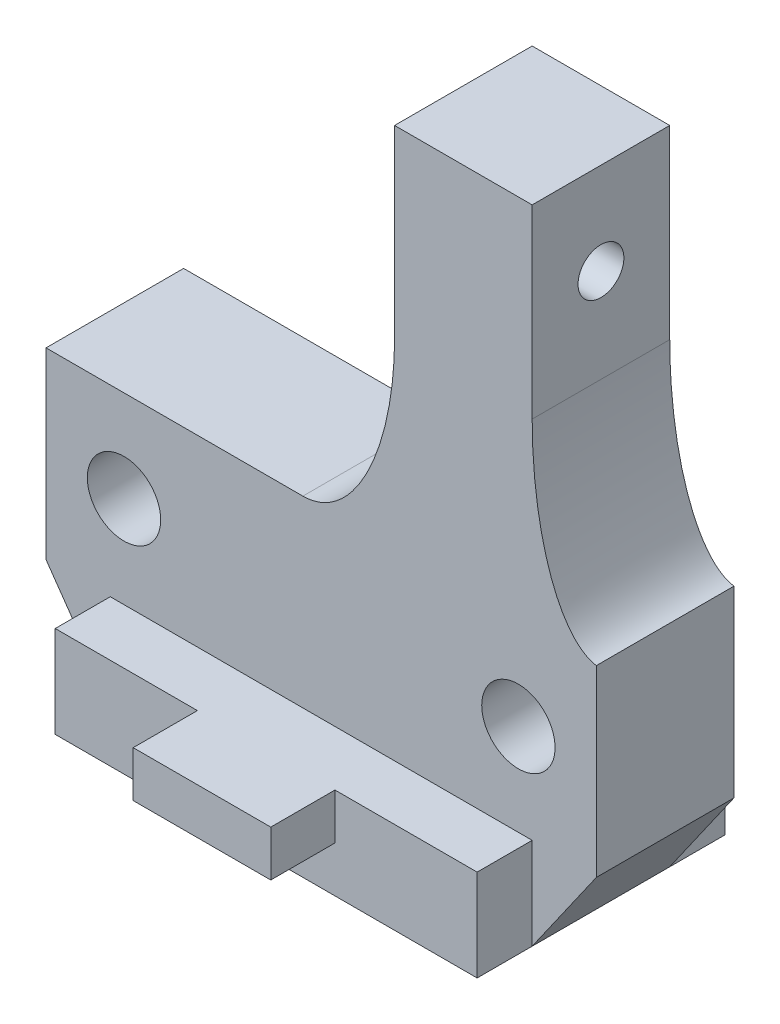
ISO-10303-21;
HEADER;
FILE_DESCRIPTION(('STEP AP214'),'2;1');
FILE_NAME('part.step','',(''),(''),'','','');
FILE_SCHEMA(('AUTOMOTIVE_DESIGN { 1 0 10303 214 1 1 1 1 }'));
ENDSEC;
DATA;
#1=APPLICATION_CONTEXT('core data for automotive mechanical design processes');
#2=APPLICATION_PROTOCOL_DEFINITION('international standard','automotive_design',2000,#1);
#3=PRODUCT_CONTEXT('',#1,'mechanical');
#4=PRODUCT('Part','Part','',(#3));
#5=PRODUCT_RELATED_PRODUCT_CATEGORY('part','',(#4));
#6=PRODUCT_DEFINITION_FORMATION('','',#4);
#7=PRODUCT_DEFINITION_CONTEXT('part definition',#1,'design');
#8=PRODUCT_DEFINITION('design','',#6,#7);
#9=PRODUCT_DEFINITION_SHAPE('','',#8);
#10=(LENGTH_UNIT() NAMED_UNIT(*) SI_UNIT(.MILLI.,.METRE.));
#11=(NAMED_UNIT(*) PLANE_ANGLE_UNIT() SI_UNIT($,.RADIAN.));
#12=(NAMED_UNIT(*) SI_UNIT($,.STERADIAN.) SOLID_ANGLE_UNIT());
#13=UNCERTAINTY_MEASURE_WITH_UNIT(LENGTH_MEASURE(1.E-05),#10,'distance_accuracy_value','');
#14=(GEOMETRIC_REPRESENTATION_CONTEXT(3) GLOBAL_UNCERTAINTY_ASSIGNED_CONTEXT((#13)) GLOBAL_UNIT_ASSIGNED_CONTEXT((#10,
#11,#12)) REPRESENTATION_CONTEXT('',''));
#15=CARTESIAN_POINT('',(0.,0.,0.));
#16=DIRECTION('',(0.,0.,1.));
#17=DIRECTION('',(1.,0.,0.));
#18=AXIS2_PLACEMENT_3D('',#15,#16,#17);
#19=CARTESIAN_POINT('',(46.,10.,0.));
#20=DIRECTION('',(-1.,0.,0.));
#21=DIRECTION('',(0.,0.,1.));
#22=AXIS2_PLACEMENT_3D('',#19,#20,#21);
#23=PLANE('',#22);
#24=DIRECTION('',(0.,1.,0.));
#25=VECTOR('',#24,1.);
#26=CARTESIAN_POINT('',(46.,10.,-21.));
#27=LINE('',#26,#25);
#28=CARTESIAN_POINT('',(46.,0.,-21.));
#29=VERTEX_POINT('',#28);
#30=CARTESIAN_POINT('',(46.,10.,-21.));
#31=VERTEX_POINT('',#30);
#32=EDGE_CURVE('E218',#29,#31,#27,.T.);
#33=ORIENTED_EDGE('',*,*,#32,.F.);
#34=DIRECTION('',(0.,0.,-1.));
#35=VECTOR('',#34,1.);
#36=CARTESIAN_POINT('',(46.,0.,0.));
#37=LINE('',#36,#35);
#38=CARTESIAN_POINT('',(46.,0.,-27.));
#39=VERTEX_POINT('',#38);
#40=EDGE_CURVE('E619',#29,#39,#37,.T.);
#41=ORIENTED_EDGE('',*,*,#40,.T.);
#42=DIRECTION('',(0.,-1.,0.));
#43=VECTOR('',#42,1.);
#44=CARTESIAN_POINT('',(46.,10.,-27.));
#45=LINE('',#44,#43);
#46=CARTESIAN_POINT('',(46.,10.,-27.));
#47=VERTEX_POINT('',#46);
#48=EDGE_CURVE('E627',#47,#39,#45,.T.);
#49=ORIENTED_EDGE('',*,*,#48,.F.);
#50=DIRECTION('',(0.,0.,-1.));
#51=VECTOR('',#50,1.);
#52=CARTESIAN_POINT('',(46.,10.,0.));
#53=LINE('',#52,#51);
#54=EDGE_CURVE('E592',#31,#47,#53,.T.);
#55=ORIENTED_EDGE('',*,*,#54,.F.);
#56=EDGE_LOOP('',(#33,#41,#49,#55));
#57=FACE_BOUND('',#56,.T.);
#58=ADVANCED_FACE('F41',(#57),#23,.F.);
#59=DIRECTION('',(0.,-1.,0.));
#60=VECTOR('',#59,1.);
#61=CARTESIAN_POINT('',(46.,10.,-6.));
#62=LINE('',#61,#60);
#63=CARTESIAN_POINT('',(46.,10.,-6.));
#64=VERTEX_POINT('',#63);
#65=CARTESIAN_POINT('',(46.,0.,-6.));
#66=VERTEX_POINT('',#65);
#67=EDGE_CURVE('E215',#64,#66,#62,.T.);
#68=ORIENTED_EDGE('',*,*,#67,.F.);
#69=CARTESIAN_POINT('',(46.,10.,0.));
#70=VERTEX_POINT('',#69);
#71=EDGE_CURVE('E608',#70,#64,#53,.T.);
#72=ORIENTED_EDGE('',*,*,#71,.F.);
#73=DIRECTION('',(0.,-1.,0.));
#74=VECTOR('',#73,1.);
#75=CARTESIAN_POINT('',(46.,10.,0.));
#76=LINE('',#75,#74);
#77=CARTESIAN_POINT('',(46.,0.,0.));
#78=VERTEX_POINT('',#77);
#79=EDGE_CURVE('E601',#70,#78,#76,.T.);
#80=ORIENTED_EDGE('',*,*,#79,.T.);
#81=EDGE_CURVE('E620',#78,#66,#37,.T.);
#82=ORIENTED_EDGE('',*,*,#81,.T.);
#83=EDGE_LOOP('',(#68,#72,#80,#82));
#84=FACE_BOUND('',#83,.T.);
#85=ADVANCED_FACE('F556',(#84),#23,.F.);
#86=CARTESIAN_POINT('',(0.,10.,0.));
#87=DIRECTION('',(1.,0.,0.));
#88=DIRECTION('',(0.,0.,-1.));
#89=AXIS2_PLACEMENT_3D('',#86,#87,#88);
#90=PLANE('',#89);
#91=DIRECTION('',(0.,1.,0.));
#92=VECTOR('',#91,1.);
#93=CARTESIAN_POINT('',(0.,10.,-6.));
#94=LINE('',#93,#92);
#95=CARTESIAN_POINT('',(0.,0.,-5.99999999999999));
#96=VERTEX_POINT('',#95);
#97=CARTESIAN_POINT('',(0.,10.,-6.));
#98=VERTEX_POINT('',#97);
#99=EDGE_CURVE('E250',#96,#98,#94,.T.);
#100=ORIENTED_EDGE('',*,*,#99,.F.);
#101=DIRECTION('',(0.,0.,1.));
#102=VECTOR('',#101,1.);
#103=CARTESIAN_POINT('',(0.,0.,0.));
#104=LINE('',#103,#102);
#105=CARTESIAN_POINT('',(0.,0.,0.));
#106=VERTEX_POINT('',#105);
#107=EDGE_CURVE('E617',#96,#106,#104,.T.);
#108=ORIENTED_EDGE('',*,*,#107,.T.);
#109=DIRECTION('',(0.,-1.,0.));
#110=VECTOR('',#109,1.);
#111=CARTESIAN_POINT('',(0.,10.,0.));
#112=LINE('',#111,#110);
#113=CARTESIAN_POINT('',(0.,10.,0.));
#114=VERTEX_POINT('',#113);
#115=EDGE_CURVE('E630',#114,#106,#112,.T.);
#116=ORIENTED_EDGE('',*,*,#115,.F.);
#117=DIRECTION('',(0.,0.,1.));
#118=VECTOR('',#117,1.);
#119=CARTESIAN_POINT('',(0.,10.,0.));
#120=LINE('',#119,#118);
#121=EDGE_CURVE('E591',#98,#114,#120,.T.);
#122=ORIENTED_EDGE('',*,*,#121,.F.);
#123=EDGE_LOOP('',(#100,#108,#116,#122));
#124=FACE_BOUND('',#123,.T.);
#125=ADVANCED_FACE('F357',(#124),#90,.F.);
#126=DIRECTION('',(0.,-1.,0.));
#127=VECTOR('',#126,1.);
#128=CARTESIAN_POINT('',(0.,10.,-21.));
#129=LINE('',#128,#127);
#130=CARTESIAN_POINT('',(0.,10.,-21.));
#131=VERTEX_POINT('',#130);
#132=CARTESIAN_POINT('',(0.,0.,-21.));
#133=VERTEX_POINT('',#132);
#134=EDGE_CURVE('E244',#131,#133,#129,.T.);
#135=ORIENTED_EDGE('',*,*,#134,.F.);
#136=CARTESIAN_POINT('',(0.,10.,-27.));
#137=VERTEX_POINT('',#136);
#138=EDGE_CURVE('E603',#137,#131,#120,.T.);
#139=ORIENTED_EDGE('',*,*,#138,.F.);
#140=DIRECTION('',(0.,-1.,0.));
#141=VECTOR('',#140,1.);
#142=CARTESIAN_POINT('',(0.,10.,-27.));
#143=LINE('',#142,#141);
#144=CARTESIAN_POINT('',(0.,0.,-27.));
#145=VERTEX_POINT('',#144);
#146=EDGE_CURVE('E612',#137,#145,#143,.T.);
#147=ORIENTED_EDGE('',*,*,#146,.T.);
#148=EDGE_CURVE('E613',#145,#133,#104,.T.);
#149=ORIENTED_EDGE('',*,*,#148,.T.);
#150=EDGE_LOOP('',(#135,#139,#147,#149));
#151=FACE_BOUND('',#150,.T.);
#152=ADVANCED_FACE('F570',(#151),#90,.F.);
#153=CARTESIAN_POINT('',(0.,10.,0.));
#154=DIRECTION('',(0.,0.,-1.));
#155=DIRECTION('',(-1.,0.,0.));
#156=AXIS2_PLACEMENT_3D('',#153,#154,#155);
#157=PLANE('',#156);
#158=DIRECTION('',(0.,-1.,0.));
#159=VECTOR('',#158,1.);
#160=CARTESIAN_POINT('',(15.5,10.,0.));
#161=LINE('',#160,#159);
#162=CARTESIAN_POINT('',(15.5,10.,0.));
#163=VERTEX_POINT('',#162);
#164=CARTESIAN_POINT('',(15.5,5.,0.));
#165=VERTEX_POINT('',#164);
#166=EDGE_CURVE('E256',#163,#165,#161,.T.);
#167=ORIENTED_EDGE('',*,*,#166,.F.);
#168=DIRECTION('',(1.,0.,0.));
#169=VECTOR('',#168,1.);
#170=CARTESIAN_POINT('',(0.,10.,0.));
#171=LINE('',#170,#169);
#172=EDGE_CURVE('E582',#114,#163,#171,.T.);
#173=ORIENTED_EDGE('',*,*,#172,.F.);
#174=ORIENTED_EDGE('',*,*,#115,.T.);
#175=DIRECTION('',(1.,0.,0.));
#176=VECTOR('',#175,1.);
#177=CARTESIAN_POINT('',(0.,0.,0.));
#178=LINE('',#177,#176);
#179=EDGE_CURVE('E616',#106,#78,#178,.T.);
#180=ORIENTED_EDGE('',*,*,#179,.T.);
#181=ORIENTED_EDGE('',*,*,#79,.F.);
#182=CARTESIAN_POINT('',(30.5,10.,0.));
#183=VERTEX_POINT('',#182);
#184=EDGE_CURVE('E593',#183,#70,#171,.T.);
#185=ORIENTED_EDGE('',*,*,#184,.F.);
#186=DIRECTION('',(0.,1.,0.));
#187=VECTOR('',#186,1.);
#188=CARTESIAN_POINT('',(30.5,10.,0.));
#189=LINE('',#188,#187);
#190=CARTESIAN_POINT('',(30.5,5.00000000000001,0.));
#191=VERTEX_POINT('',#190);
#192=EDGE_CURVE('E262',#191,#183,#189,.T.);
#193=ORIENTED_EDGE('',*,*,#192,.F.);
#194=DIRECTION('',(1.,0.,0.));
#195=VECTOR('',#194,1.);
#196=CARTESIAN_POINT('',(15.5,5.,0.));
#197=LINE('',#196,#195);
#198=EDGE_CURVE('E271',#165,#191,#197,.T.);
#199=ORIENTED_EDGE('',*,*,#198,.F.);
#200=EDGE_LOOP('',(#167,#173,#174,#180,#181,#185,#193,#199));
#201=FACE_BOUND('',#200,.T.);
#202=ADVANCED_FACE('F567',(#201),#157,.F.);
#203=CARTESIAN_POINT('',(0.,10.,0.));
#204=DIRECTION('',(0.,-1.,0.));
#205=DIRECTION('',(0.,0.,-1.));
#206=AXIS2_PLACEMENT_3D('',#203,#204,#205);
#207=PLANE('',#206);
#208=DIRECTION('',(-1.,0.,0.));
#209=VECTOR('',#208,1.);
#210=CARTESIAN_POINT('',(-7.,10.,-21.));
#211=LINE('',#210,#209);
#212=EDGE_CURVE('E633',#31,#131,#211,.T.);
#213=ORIENTED_EDGE('',*,*,#212,.F.);
#214=ORIENTED_EDGE('',*,*,#54,.T.);
#215=DIRECTION('',(-1.,0.,0.));
#216=VECTOR('',#215,1.);
#217=CARTESIAN_POINT('',(0.,10.,-27.));
#218=LINE('',#217,#216);
#219=EDGE_CURVE('E610',#47,#137,#218,.T.);
#220=ORIENTED_EDGE('',*,*,#219,.T.);
#221=ORIENTED_EDGE('',*,*,#138,.T.);
#222=EDGE_LOOP('',(#213,#214,#220,#221));
#223=FACE_BOUND('',#222,.T.);
#224=ADVANCED_FACE('F569',(#223),#207,.F.);
#225=DIRECTION('',(1.,0.,0.));
#226=VECTOR('',#225,1.);
#227=CARTESIAN_POINT('',(-6.99999999999999,10.,-6.));
#228=LINE('',#227,#226);
#229=EDGE_CURVE('E631',#98,#64,#228,.T.);
#230=ORIENTED_EDGE('',*,*,#229,.F.);
#231=ORIENTED_EDGE('',*,*,#121,.T.);
#232=ORIENTED_EDGE('',*,*,#172,.T.);
#233=DIRECTION('',(0.,0.,-1.));
#234=VECTOR('',#233,1.);
#235=CARTESIAN_POINT('',(15.5,10.,7.));
#236=LINE('',#235,#234);
#237=CARTESIAN_POINT('',(15.5,10.,7.));
#238=VERTEX_POINT('',#237);
#239=EDGE_CURVE('E268',#238,#163,#236,.T.);
#240=ORIENTED_EDGE('',*,*,#239,.F.);
#241=DIRECTION('',(-1.,0.,0.));
#242=VECTOR('',#241,1.);
#243=CARTESIAN_POINT('',(15.5,10.,7.));
#244=LINE('',#243,#242);
#245=CARTESIAN_POINT('',(30.5,10.,7.));
#246=VERTEX_POINT('',#245);
#247=EDGE_CURVE('E266',#246,#238,#244,.T.);
#248=ORIENTED_EDGE('',*,*,#247,.F.);
#249=DIRECTION('',(0.,0.,-1.));
#250=VECTOR('',#249,1.);
#251=CARTESIAN_POINT('',(30.5,10.,7.));
#252=LINE('',#251,#250);
#253=EDGE_CURVE('E278',#246,#183,#252,.T.);
#254=ORIENTED_EDGE('',*,*,#253,.T.);
#255=ORIENTED_EDGE('',*,*,#184,.T.);
#256=ORIENTED_EDGE('',*,*,#71,.T.);
#257=EDGE_LOOP('',(#230,#231,#232,#240,#248,#254,#255,#256));
#258=FACE_BOUND('',#257,.T.);
#259=ADVANCED_FACE('F576',(#258),#207,.F.);
#260=CARTESIAN_POINT('',(0.,10.,-27.));
#261=DIRECTION('',(0.,0.,1.));
#262=DIRECTION('',(1.,0.,0.));
#263=AXIS2_PLACEMENT_3D('',#260,#261,#262);
#264=PLANE('',#263);
#265=DIRECTION('',(-1.,0.,0.));
#266=VECTOR('',#265,1.);
#267=CARTESIAN_POINT('',(0.,0.,-27.));
#268=LINE('',#267,#266);
#269=EDGE_CURVE('E623',#39,#145,#268,.T.);
#270=ORIENTED_EDGE('',*,*,#269,.T.);
#271=ORIENTED_EDGE('',*,*,#146,.F.);
#272=ORIENTED_EDGE('',*,*,#219,.F.);
#273=ORIENTED_EDGE('',*,*,#48,.T.);
#274=EDGE_LOOP('',(#270,#271,#272,#273));
#275=FACE_BOUND('',#274,.T.);
#276=ADVANCED_FACE('F565',(#275),#264,.F.);
#277=CARTESIAN_POINT('',(0.,0.,0.));
#278=DIRECTION('',(0.,-1.,0.));
#279=DIRECTION('',(0.,0.,-1.));
#280=AXIS2_PLACEMENT_3D('',#277,#278,#279);
#281=PLANE('',#280);
#282=ORIENTED_EDGE('',*,*,#148,.F.);
#283=ORIENTED_EDGE('',*,*,#269,.F.);
#284=ORIENTED_EDGE('',*,*,#40,.F.);
#285=DIRECTION('',(0.,0.,-1.));
#286=VECTOR('',#285,1.);
#287=CARTESIAN_POINT('',(46.,0.,-6.));
#288=LINE('',#287,#286);
#289=EDGE_CURVE('E241',#66,#29,#288,.T.);
#290=ORIENTED_EDGE('',*,*,#289,.F.);
#291=ORIENTED_EDGE('',*,*,#81,.F.);
#292=ORIENTED_EDGE('',*,*,#179,.F.);
#293=ORIENTED_EDGE('',*,*,#107,.F.);
#294=DIRECTION('',(0.,0.,1.));
#295=VECTOR('',#294,1.);
#296=CARTESIAN_POINT('',(0.,0.,-21.));
#297=LINE('',#296,#295);
#298=EDGE_CURVE('E252',#133,#96,#297,.T.);
#299=ORIENTED_EDGE('',*,*,#298,.F.);
#300=EDGE_LOOP('',(#282,#283,#284,#290,#291,#292,#293,#299));
#301=FACE_BOUND('',#300,.T.);
#302=ADVANCED_FACE('F649',(#301),#281,.T.);
#303=CARTESIAN_POINT('',(-7.,30.,-21.));
#304=DIRECTION('',(1.,0.,0.));
#305=DIRECTION('',(0.,0.,-1.));
#306=AXIS2_PLACEMENT_3D('',#303,#304,#305);
#307=PLANE('',#306);
#308=DIRECTION('',(0.,0.,1.));
#309=VECTOR('',#308,1.);
#310=CARTESIAN_POINT('',(-7.,10.,-21.));
#311=LINE('',#310,#309);
#312=CARTESIAN_POINT('',(-7.,10.,-21.));
#313=VERTEX_POINT('',#312);
#314=CARTESIAN_POINT('',(-7.,10.,-6.));
#315=VERTEX_POINT('',#314);
#316=EDGE_CURVE('E299',#313,#315,#311,.T.);
#317=ORIENTED_EDGE('',*,*,#316,.T.);
#318=DIRECTION('',(0.,-1.,0.));
#319=VECTOR('',#318,1.);
#320=CARTESIAN_POINT('',(-6.99999999999999,30.,-6.));
#321=LINE('',#320,#319);
#322=CARTESIAN_POINT('',(-6.99999999999999,30.,-6.));
#323=VERTEX_POINT('',#322);
#324=EDGE_CURVE('E422',#323,#315,#321,.T.);
#325=ORIENTED_EDGE('',*,*,#324,.F.);
#326=DIRECTION('',(0.,0.,1.));
#327=VECTOR('',#326,1.);
#328=CARTESIAN_POINT('',(-7.,30.,-21.));
#329=LINE('',#328,#327);
#330=CARTESIAN_POINT('',(-7.,30.,-21.));
#331=VERTEX_POINT('',#330);
#332=EDGE_CURVE('E300',#331,#323,#329,.T.);
#333=ORIENTED_EDGE('',*,*,#332,.F.);
#334=DIRECTION('',(0.,-1.,0.));
#335=VECTOR('',#334,1.);
#336=CARTESIAN_POINT('',(-7.,30.,-21.));
#337=LINE('',#336,#335);
#338=EDGE_CURVE('E328',#331,#313,#337,.T.);
#339=ORIENTED_EDGE('',*,*,#338,.T.);
#340=EDGE_LOOP('',(#317,#325,#333,#339));
#341=FACE_BOUND('',#340,.T.);
#342=ADVANCED_FACE('F446',(#341),#307,.F.);
#343=CARTESIAN_POINT('',(-6.99999999999999,30.,-6.));
#344=DIRECTION('',(0.,0.,-1.));
#345=DIRECTION('',(-1.,0.,0.));
#346=AXIS2_PLACEMENT_3D('',#343,#344,#345);
#347=PLANE('',#346);
#348=CARTESIAN_POINT('',(44.5,20.,-6.));
#349=DIRECTION('',(0.,0.,-1.));
#350=DIRECTION('',(-1.,0.,0.));
#351=AXIS2_PLACEMENT_3D('',#348,#349,#350);
#352=CIRCLE('',#351,4.);
#353=CARTESIAN_POINT('',(40.5,20.,-6.));
#354=VERTEX_POINT('',#353);
#355=EDGE_CURVE('E296',#354,#354,#352,.T.);
#356=ORIENTED_EDGE('',*,*,#355,.T.);
#357=EDGE_LOOP('',(#356));
#358=FACE_BOUND('',#357,.T.);
#359=CARTESIAN_POINT('',(1.5,20.,-6.));
#360=DIRECTION('',(0.,0.,-1.));
#361=DIRECTION('',(-1.,0.,0.));
#362=AXIS2_PLACEMENT_3D('',#359,#360,#361);
#363=CIRCLE('',#362,4.);
#364=CARTESIAN_POINT('',(-2.5,20.,-6.));
#365=VERTEX_POINT('',#364);
#366=EDGE_CURVE('E291',#365,#365,#363,.T.);
#367=ORIENTED_EDGE('',*,*,#366,.T.);
#368=EDGE_LOOP('',(#367));
#369=FACE_BOUND('',#368,.T.);
#370=ORIENTED_EDGE('',*,*,#324,.T.);
#371=DIRECTION('',(0.573462344363329,-0.81923192051904,0.));
#372=VECTOR('',#371,1.);
#373=CARTESIAN_POINT('',(-12.4316726028097,17.7595322897281,-6.));
#374=LINE('',#373,#372);
#375=EDGE_CURVE('E246',#315,#96,#374,.T.);
#376=ORIENTED_EDGE('',*,*,#375,.T.);
#377=ORIENTED_EDGE('',*,*,#99,.T.);
#378=ORIENTED_EDGE('',*,*,#229,.T.);
#379=ORIENTED_EDGE('',*,*,#67,.T.);
#380=DIRECTION('',(0.573462344363328,0.81923192051904,0.));
#381=VECTOR('',#380,1.);
#382=CARTESIAN_POINT('',(58.4316726028097,17.7595322897281,-6.));
#383=LINE('',#382,#381);
#384=CARTESIAN_POINT('',(53.,10.,-6.));
#385=VERTEX_POINT('',#384);
#386=EDGE_CURVE('E239',#66,#385,#383,.T.);
#387=ORIENTED_EDGE('',*,*,#386,.T.);
#388=DIRECTION('',(0.,-1.,0.));
#389=VECTOR('',#388,1.);
#390=CARTESIAN_POINT('',(53.,30.,-6.));
#391=LINE('',#390,#389);
#392=CARTESIAN_POINT('',(53.,30.,-6.));
#393=VERTEX_POINT('',#392);
#394=EDGE_CURVE('E419',#393,#385,#391,.T.);
#395=ORIENTED_EDGE('',*,*,#394,.F.);
#396=CARTESIAN_POINT('',(46.,49.7737199332852,-6.));
#397=CARTESIAN_POINT('',(46.,31.0620156485908,-6.));
#398=CARTESIAN_POINT('',(53.,30.,-6.));
#399=(BOUNDED_CURVE() B_SPLINE_CURVE(2,(#396,#397,#398),.UNSPECIFIED.,.F.,
.F.) B_SPLINE_CURVE_WITH_KNOTS((3,3),(0.,1.),
.UNSPECIFIED.) CURVE() GEOMETRIC_REPRESENTATION_ITEM() RATIONAL_B_SPLINE_CURVE((1.,
0.758287544405155,1.)) REPRESENTATION_ITEM(''));
#400=CARTESIAN_POINT('',(46.,49.7737199332852,-6.));
#401=VERTEX_POINT('',#400);
#402=EDGE_CURVE('E12',#393,#401,#399,.F.);
#403=ORIENTED_EDGE('',*,*,#402,.T.);
#404=DIRECTION('',(0.,-1.,0.));
#405=VECTOR('',#404,1.);
#406=CARTESIAN_POINT('',(46.,70.,-6.));
#407=LINE('',#406,#405);
#408=CARTESIAN_POINT('',(46.,70.,-6.));
#409=VERTEX_POINT('',#408);
#410=EDGE_CURVE('E229',#409,#401,#407,.T.);
#411=ORIENTED_EDGE('',*,*,#410,.F.);
#412=DIRECTION('',(1.,0.,0.));
#413=VECTOR('',#412,1.);
#414=CARTESIAN_POINT('',(46.,70.,-6.));
#415=LINE('',#414,#413);
#416=CARTESIAN_POINT('',(31.,70.,-6.));
#417=VERTEX_POINT('',#416);
#418=EDGE_CURVE('E208',#417,#409,#415,.T.);
#419=ORIENTED_EDGE('',*,*,#418,.F.);
#420=DIRECTION('',(0.,-1.,0.));
#421=VECTOR('',#420,1.);
#422=CARTESIAN_POINT('',(31.,70.,-6.));
#423=LINE('',#422,#421);
#424=CARTESIAN_POINT('',(31.,50.,-6.));
#425=VERTEX_POINT('',#424);
#426=EDGE_CURVE('E220',#417,#425,#423,.T.);
#427=ORIENTED_EDGE('',*,*,#426,.T.);
#428=CARTESIAN_POINT('',(21.,30.,-5.99999999999999));
#429=CARTESIAN_POINT('',(31.,30.,-6.));
#430=CARTESIAN_POINT('',(31.,50.,-6.));
#431=(BOUNDED_CURVE() B_SPLINE_CURVE(2,(#428,#429,#430),.UNSPECIFIED.,.F.,
.F.) B_SPLINE_CURVE_WITH_KNOTS((3,3),(0.,1.),
.UNSPECIFIED.) CURVE() GEOMETRIC_REPRESENTATION_ITEM() RATIONAL_B_SPLINE_CURVE((1.,
0.707106781186548,1.)) REPRESENTATION_ITEM(''));
#432=CARTESIAN_POINT('',(21.,30.,-6.));
#433=VERTEX_POINT('',#432);
#434=EDGE_CURVE('E335',#425,#433,#431,.F.);
#435=ORIENTED_EDGE('',*,*,#434,.T.);
#436=DIRECTION('',(1.,0.,0.));
#437=VECTOR('',#436,1.);
#438=CARTESIAN_POINT('',(-6.99999999999999,30.,-6.));
#439=LINE('',#438,#437);
#440=EDGE_CURVE('E303',#323,#433,#439,.T.);
#441=ORIENTED_EDGE('',*,*,#440,.F.);
#442=EDGE_LOOP('',(#370,#376,#377,#378,#379,#387,#395,#403,#411,#419,#427,#435,#441));
#443=FACE_BOUND('',#442,.T.);
#444=ADVANCED_FACE('F437',(#358,#369,#443),#347,.F.);
#445=CARTESIAN_POINT('',(53.,30.,-21.));
#446=DIRECTION('',(-1.,0.,0.));
#447=DIRECTION('',(0.,0.,1.));
#448=AXIS2_PLACEMENT_3D('',#445,#446,#447);
#449=PLANE('',#448);
#450=DIRECTION('',(0.,0.,-1.));
#451=VECTOR('',#450,1.);
#452=CARTESIAN_POINT('',(53.,10.,-21.));
#453=LINE('',#452,#451);
#454=CARTESIAN_POINT('',(53.,10.,-21.));
#455=VERTEX_POINT('',#454);
#456=EDGE_CURVE('E304',#385,#455,#453,.T.);
#457=ORIENTED_EDGE('',*,*,#456,.T.);
#458=DIRECTION('',(0.,-1.,0.));
#459=VECTOR('',#458,1.);
#460=CARTESIAN_POINT('',(53.,30.,-21.));
#461=LINE('',#460,#459);
#462=CARTESIAN_POINT('',(53.,30.,-21.));
#463=VERTEX_POINT('',#462);
#464=EDGE_CURVE('E420',#463,#455,#461,.T.);
#465=ORIENTED_EDGE('',*,*,#464,.F.);
#466=CARTESIAN_POINT('',(53.,30.,-5.25));
#467=CARTESIAN_POINT('',(53.,30.,-10.75));
#468=CARTESIAN_POINT('',(53.,30.,-16.25));
#469=CARTESIAN_POINT('',(53.,30.,-21.75));
#470=(BOUNDED_CURVE() B_SPLINE_CURVE(3,(#466,#467,#468,#469),.UNSPECIFIED.,.F.,
.F.) B_SPLINE_CURVE_WITH_KNOTS((4,4),(-0.00075,0.01575),
.UNSPECIFIED.) CURVE() GEOMETRIC_REPRESENTATION_ITEM() RATIONAL_B_SPLINE_CURVE((1.,1.,1.,1.)) REPRESENTATION_ITEM(''));
#471=EDGE_CURVE('E312',#393,#463,#470,.T.);
#472=ORIENTED_EDGE('',*,*,#471,.F.);
#473=ORIENTED_EDGE('',*,*,#394,.T.);
#474=EDGE_LOOP('',(#457,#465,#472,#473));
#475=FACE_BOUND('',#474,.T.);
#476=ADVANCED_FACE('F418',(#475),#449,.F.);
#477=CARTESIAN_POINT('',(-7.,30.,-21.));
#478=DIRECTION('',(0.,0.,1.));
#479=DIRECTION('',(1.,0.,0.));
#480=AXIS2_PLACEMENT_3D('',#477,#478,#479);
#481=PLANE('',#480);
#482=CARTESIAN_POINT('',(44.5,20.,-21.));
#483=DIRECTION('',(0.,0.,-1.));
#484=DIRECTION('',(-1.,0.,0.));
#485=AXIS2_PLACEMENT_3D('',#482,#483,#484);
#486=CIRCLE('',#485,4.);
#487=CARTESIAN_POINT('',(40.5,20.,-21.));
#488=VERTEX_POINT('',#487);
#489=EDGE_CURVE('E288',#488,#488,#486,.T.);
#490=ORIENTED_EDGE('',*,*,#489,.F.);
#491=EDGE_LOOP('',(#490));
#492=FACE_BOUND('',#491,.T.);
#493=CARTESIAN_POINT('',(1.5,20.,-21.));
#494=DIRECTION('',(0.,0.,-1.));
#495=DIRECTION('',(1.,0.,0.));
#496=AXIS2_PLACEMENT_3D('',#493,#494,#495);
#497=CIRCLE('',#496,4.);
#498=CARTESIAN_POINT('',(5.5,20.,-21.));
#499=VERTEX_POINT('',#498);
#500=EDGE_CURVE('E287',#499,#499,#497,.T.);
#501=ORIENTED_EDGE('',*,*,#500,.F.);
#502=EDGE_LOOP('',(#501));
#503=FACE_BOUND('',#502,.T.);
#504=ORIENTED_EDGE('',*,*,#464,.T.);
#505=DIRECTION('',(-0.573462344363328,-0.81923192051904,0.));
#506=VECTOR('',#505,1.);
#507=CARTESIAN_POINT('',(58.4316726028097,17.7595322897281,-21.));
#508=LINE('',#507,#506);
#509=EDGE_CURVE('E236',#455,#29,#508,.T.);
#510=ORIENTED_EDGE('',*,*,#509,.T.);
#511=ORIENTED_EDGE('',*,*,#32,.T.);
#512=ORIENTED_EDGE('',*,*,#212,.T.);
#513=ORIENTED_EDGE('',*,*,#134,.T.);
#514=DIRECTION('',(-0.573462344363329,0.81923192051904,0.));
#515=VECTOR('',#514,1.);
#516=CARTESIAN_POINT('',(-12.4316726028097,17.7595322897281,-21.));
#517=LINE('',#516,#515);
#518=EDGE_CURVE('E249',#133,#313,#517,.T.);
#519=ORIENTED_EDGE('',*,*,#518,.T.);
#520=ORIENTED_EDGE('',*,*,#338,.F.);
#521=DIRECTION('',(-1.,0.,0.));
#522=VECTOR('',#521,1.);
#523=CARTESIAN_POINT('',(-7.,30.,-21.));
#524=LINE('',#523,#522);
#525=CARTESIAN_POINT('',(21.,30.,-21.));
#526=VERTEX_POINT('',#525);
#527=EDGE_CURVE('E313',#526,#331,#524,.T.);
#528=ORIENTED_EDGE('',*,*,#527,.F.);
#529=CARTESIAN_POINT('',(31.,50.,-21.));
#530=CARTESIAN_POINT('',(31.,30.,-21.));
#531=CARTESIAN_POINT('',(21.,30.,-21.));
#532=(BOUNDED_CURVE() B_SPLINE_CURVE(2,(#529,#530,#531),.UNSPECIFIED.,.F.,
.F.) B_SPLINE_CURVE_WITH_KNOTS((3,3),(0.,1.),
.UNSPECIFIED.) CURVE() GEOMETRIC_REPRESENTATION_ITEM() RATIONAL_B_SPLINE_CURVE((1.,
0.707106781186548,1.)) REPRESENTATION_ITEM(''));
#533=CARTESIAN_POINT('',(31.,50.,-21.));
#534=VERTEX_POINT('',#533);
#535=EDGE_CURVE('E325',#526,#534,#532,.F.);
#536=ORIENTED_EDGE('',*,*,#535,.T.);
#537=DIRECTION('',(0.,-1.,0.));
#538=VECTOR('',#537,1.);
#539=CARTESIAN_POINT('',(31.,70.,-21.));
#540=LINE('',#539,#538);
#541=CARTESIAN_POINT('',(31.,70.,-21.));
#542=VERTEX_POINT('',#541);
#543=EDGE_CURVE('E199',#542,#534,#540,.T.);
#544=ORIENTED_EDGE('',*,*,#543,.F.);
#545=DIRECTION('',(-1.,0.,0.));
#546=VECTOR('',#545,1.);
#547=CARTESIAN_POINT('',(46.,70.,-21.));
#548=LINE('',#547,#546);
#549=CARTESIAN_POINT('',(46.,70.,-21.));
#550=VERTEX_POINT('',#549);
#551=EDGE_CURVE('E192',#550,#542,#548,.T.);
#552=ORIENTED_EDGE('',*,*,#551,.F.);
#553=DIRECTION('',(0.,-1.,0.));
#554=VECTOR('',#553,1.);
#555=CARTESIAN_POINT('',(46.,70.,-21.));
#556=LINE('',#555,#554);
#557=CARTESIAN_POINT('',(46.,49.7737199332852,-21.));
#558=VERTEX_POINT('',#557);
#559=EDGE_CURVE('E197',#550,#558,#556,.T.);
#560=ORIENTED_EDGE('',*,*,#559,.T.);
#561=CARTESIAN_POINT('',(53.,30.,-21.));
#562=CARTESIAN_POINT('',(46.,31.0620156485908,-21.));
#563=CARTESIAN_POINT('',(46.,49.7737199332852,-21.));
#564=(BOUNDED_CURVE() B_SPLINE_CURVE(2,(#561,#562,#563),.UNSPECIFIED.,.F.,
.F.) B_SPLINE_CURVE_WITH_KNOTS((3,3),(0.,1.),
.UNSPECIFIED.) CURVE() GEOMETRIC_REPRESENTATION_ITEM() RATIONAL_B_SPLINE_CURVE((1.,
0.758287544405155,1.)) REPRESENTATION_ITEM(''));
#565=EDGE_CURVE('E56',#558,#463,#564,.F.);
#566=ORIENTED_EDGE('',*,*,#565,.T.);
#567=EDGE_LOOP('',(#504,#510,#511,#512,#513,#519,#520,#528,#536,#544,#552,#560,#566));
#568=FACE_BOUND('',#567,.T.);
#569=ADVANCED_FACE('F195',(#492,#503,#568),#481,.F.);
#570=CARTESIAN_POINT('',(0.,30.,0.));
#571=DIRECTION('',(0.,1.,0.));
#572=DIRECTION('',(0.,0.,1.));
#573=AXIS2_PLACEMENT_3D('',#570,#571,#572);
#574=PLANE('',#573);
#575=ORIENTED_EDGE('',*,*,#440,.T.);
#576=CARTESIAN_POINT('',(21.,30.,-21.75));
#577=CARTESIAN_POINT('',(21.,30.,-16.25));
#578=CARTESIAN_POINT('',(21.,30.,-10.75));
#579=CARTESIAN_POINT('',(21.,30.,-5.24999999999999));
#580=(BOUNDED_CURVE() B_SPLINE_CURVE(3,(#576,#577,#578,#579),.UNSPECIFIED.,.F.,
.F.) B_SPLINE_CURVE_WITH_KNOTS((4,4),(-0.01575,0.00075),
.UNSPECIFIED.) CURVE() GEOMETRIC_REPRESENTATION_ITEM() RATIONAL_B_SPLINE_CURVE((1.,1.,1.,1.)) REPRESENTATION_ITEM(''));
#581=EDGE_CURVE('E317',#433,#526,#580,.F.);
#582=ORIENTED_EDGE('',*,*,#581,.T.);
#583=ORIENTED_EDGE('',*,*,#527,.T.);
#584=ORIENTED_EDGE('',*,*,#332,.T.);
#585=EDGE_LOOP('',(#575,#582,#583,#584));
#586=FACE_BOUND('',#585,.T.);
#587=ADVANCED_FACE('F319',(#586),#574,.T.);
#588=CARTESIAN_POINT('',(1.5,20.,0.));
#589=DIRECTION('',(0.,0.,-1.));
#590=DIRECTION('',(-1.,0.,0.));
#591=AXIS2_PLACEMENT_3D('',#588,#589,#590);
#592=CYLINDRICAL_SURFACE('',#591,4.);
#593=ORIENTED_EDGE('',*,*,#500,.T.);
#594=EDGE_LOOP('',(#593));
#595=FACE_BOUND('',#594,.T.);
#596=ORIENTED_EDGE('',*,*,#366,.F.);
#597=EDGE_LOOP('',(#596));
#598=FACE_BOUND('',#597,.T.);
#599=ADVANCED_FACE('F476',(#595,#598),#592,.F.);
#600=CARTESIAN_POINT('',(44.5,20.,0.));
#601=DIRECTION('',(0.,0.,-1.));
#602=DIRECTION('',(-1.,0.,0.));
#603=AXIS2_PLACEMENT_3D('',#600,#601,#602);
#604=CYLINDRICAL_SURFACE('',#603,4.);
#605=ORIENTED_EDGE('',*,*,#489,.T.);
#606=EDGE_LOOP('',(#605));
#607=FACE_BOUND('',#606,.T.);
#608=ORIENTED_EDGE('',*,*,#355,.F.);
#609=EDGE_LOOP('',(#608));
#610=FACE_BOUND('',#609,.T.);
#611=ADVANCED_FACE('F479',(#607,#610),#604,.F.);
#612=CARTESIAN_POINT('',(15.5,10.,7.));
#613=DIRECTION('',(1.,0.,0.));
#614=DIRECTION('',(0.,1.,0.));
#615=AXIS2_PLACEMENT_3D('',#612,#613,#614);
#616=PLANE('',#615);
#617=ORIENTED_EDGE('',*,*,#166,.T.);
#618=DIRECTION('',(0.,0.,-1.));
#619=VECTOR('',#618,1.);
#620=CARTESIAN_POINT('',(15.5,5.,7.));
#621=LINE('',#620,#619);
#622=CARTESIAN_POINT('',(15.5,5.,7.));
#623=VERTEX_POINT('',#622);
#624=EDGE_CURVE('E284',#623,#165,#621,.T.);
#625=ORIENTED_EDGE('',*,*,#624,.F.);
#626=DIRECTION('',(0.,-1.,0.));
#627=VECTOR('',#626,1.);
#628=CARTESIAN_POINT('',(15.5,10.,7.));
#629=LINE('',#628,#627);
#630=EDGE_CURVE('E258',#238,#623,#629,.T.);
#631=ORIENTED_EDGE('',*,*,#630,.F.);
#632=ORIENTED_EDGE('',*,*,#239,.T.);
#633=EDGE_LOOP('',(#617,#625,#631,#632));
#634=FACE_BOUND('',#633,.T.);
#635=ADVANCED_FACE('F483',(#634),#616,.F.);
#636=CARTESIAN_POINT('',(15.5,5.,7.));
#637=DIRECTION('',(0.,1.,0.));
#638=DIRECTION('',(-1.,0.,0.));
#639=AXIS2_PLACEMENT_3D('',#636,#637,#638);
#640=PLANE('',#639);
#641=ORIENTED_EDGE('',*,*,#198,.T.);
#642=DIRECTION('',(0.,0.,-1.));
#643=VECTOR('',#642,1.);
#644=CARTESIAN_POINT('',(30.5,5.00000000000001,7.));
#645=LINE('',#644,#643);
#646=CARTESIAN_POINT('',(30.5,5.00000000000001,7.));
#647=VERTEX_POINT('',#646);
#648=EDGE_CURVE('E281',#647,#191,#645,.T.);
#649=ORIENTED_EDGE('',*,*,#648,.F.);
#650=DIRECTION('',(1.,0.,0.));
#651=VECTOR('',#650,1.);
#652=CARTESIAN_POINT('',(15.5,5.,7.));
#653=LINE('',#652,#651);
#654=EDGE_CURVE('E261',#623,#647,#653,.T.);
#655=ORIENTED_EDGE('',*,*,#654,.F.);
#656=ORIENTED_EDGE('',*,*,#624,.T.);
#657=EDGE_LOOP('',(#641,#649,#655,#656));
#658=FACE_BOUND('',#657,.T.);
#659=ADVANCED_FACE('F487',(#658),#640,.F.);
#660=CARTESIAN_POINT('',(30.5,10.,7.));
#661=DIRECTION('',(-1.,0.,0.));
#662=DIRECTION('',(0.,0.,1.));
#663=AXIS2_PLACEMENT_3D('',#660,#661,#662);
#664=PLANE('',#663);
#665=ORIENTED_EDGE('',*,*,#192,.T.);
#666=ORIENTED_EDGE('',*,*,#253,.F.);
#667=DIRECTION('',(0.,1.,0.));
#668=VECTOR('',#667,1.);
#669=CARTESIAN_POINT('',(30.5,10.,7.));
#670=LINE('',#669,#668);
#671=EDGE_CURVE('E264',#647,#246,#670,.T.);
#672=ORIENTED_EDGE('',*,*,#671,.F.);
#673=ORIENTED_EDGE('',*,*,#648,.T.);
#674=EDGE_LOOP('',(#665,#666,#672,#673));
#675=FACE_BOUND('',#674,.T.);
#676=ADVANCED_FACE('F491',(#675),#664,.F.);
#677=CARTESIAN_POINT('',(0.,0.,7.));
#678=DIRECTION('',(0.,0.,1.));
#679=DIRECTION('',(1.,0.,0.));
#680=AXIS2_PLACEMENT_3D('',#677,#678,#679);
#681=PLANE('',#680);
#682=ORIENTED_EDGE('',*,*,#630,.T.);
#683=ORIENTED_EDGE('',*,*,#654,.T.);
#684=ORIENTED_EDGE('',*,*,#671,.T.);
#685=ORIENTED_EDGE('',*,*,#247,.T.);
#686=EDGE_LOOP('',(#682,#683,#684,#685));
#687=FACE_BOUND('',#686,.T.);
#688=ADVANCED_FACE('F495',(#687),#681,.T.);
#689=CARTESIAN_POINT('',(0.,0.,0.));
#690=DIRECTION('',(0.81923192051904,0.573462344363329,0.));
#691=DIRECTION('',(-0.573462344363329,0.81923192051904,0.));
#692=AXIS2_PLACEMENT_3D('',#689,#690,#691);
#693=PLANE('',#692);
#694=ORIENTED_EDGE('',*,*,#298,.T.);
#695=ORIENTED_EDGE('',*,*,#375,.F.);
#696=ORIENTED_EDGE('',*,*,#316,.F.);
#697=ORIENTED_EDGE('',*,*,#518,.F.);
#698=EDGE_LOOP('',(#694,#695,#696,#697));
#699=FACE_BOUND('',#698,.T.);
#700=ADVANCED_FACE('F499',(#699),#693,.F.);
#701=CARTESIAN_POINT('',(30.8724832214765,-21.6107382550336,0.));
#702=DIRECTION('',(-0.81923192051904,0.573462344363328,0.));
#703=DIRECTION('',(-0.573462344363328,-0.81923192051904,0.));
#704=AXIS2_PLACEMENT_3D('',#701,#702,#703);
#705=PLANE('',#704);
#706=ORIENTED_EDGE('',*,*,#289,.T.);
#707=ORIENTED_EDGE('',*,*,#509,.F.);
#708=ORIENTED_EDGE('',*,*,#456,.F.);
#709=ORIENTED_EDGE('',*,*,#386,.F.);
#710=EDGE_LOOP('',(#706,#707,#708,#709));
#711=FACE_BOUND('',#710,.T.);
#712=ADVANCED_FACE('F503',(#711),#705,.F.);
#713=CARTESIAN_POINT('',(46.,70.,-6.));
#714=DIRECTION('',(-1.,0.,0.));
#715=DIRECTION('',(0.,0.,1.));
#716=AXIS2_PLACEMENT_3D('',#713,#714,#715);
#717=PLANE('',#716);
#718=CARTESIAN_POINT('',(46.,60.,-13.5));
#719=DIRECTION('',(1.,0.,0.));
#720=DIRECTION('',(0.,0.,-1.));
#721=AXIS2_PLACEMENT_3D('',#718,#719,#720);
#722=CIRCLE('',#721,2.5);
#723=CARTESIAN_POINT('',(46.,60.,-16.));
#724=VERTEX_POINT('',#723);
#725=EDGE_CURVE('E544',#724,#724,#722,.T.);
#726=ORIENTED_EDGE('',*,*,#725,.F.);
#727=EDGE_LOOP('',(#726));
#728=FACE_BOUND('',#727,.T.);
#729=ORIENTED_EDGE('',*,*,#410,.T.);
#730=CARTESIAN_POINT('',(46.,49.7737199332852,-21.75));
#731=CARTESIAN_POINT('',(46.,49.7737199332852,-16.25));
#732=CARTESIAN_POINT('',(46.,49.7737199332852,-10.75));
#733=CARTESIAN_POINT('',(46.,49.7737199332852,-5.25));
#734=(BOUNDED_CURVE() B_SPLINE_CURVE(3,(#730,#731,#732,#733),.UNSPECIFIED.,.F.,
.F.) B_SPLINE_CURVE_WITH_KNOTS((4,4),(-0.000750000000000001,0.01575),
.UNSPECIFIED.) CURVE() GEOMETRIC_REPRESENTATION_ITEM() RATIONAL_B_SPLINE_CURVE((1.,1.,1.,1.)) REPRESENTATION_ITEM(''));
#735=EDGE_CURVE('E213',#401,#558,#734,.F.);
#736=ORIENTED_EDGE('',*,*,#735,.T.);
#737=ORIENTED_EDGE('',*,*,#559,.F.);
#738=DIRECTION('',(0.,0.,-1.));
#739=VECTOR('',#738,1.);
#740=CARTESIAN_POINT('',(46.,70.,-6.));
#741=LINE('',#740,#739);
#742=EDGE_CURVE('E203',#409,#550,#741,.T.);
#743=ORIENTED_EDGE('',*,*,#742,.F.);
#744=EDGE_LOOP('',(#729,#736,#737,#743));
#745=FACE_BOUND('',#744,.T.);
#746=ADVANCED_FACE('F212',(#728,#745),#717,.F.);
#747=CARTESIAN_POINT('',(31.,70.,-6.));
#748=DIRECTION('',(1.,0.,0.));
#749=DIRECTION('',(0.,0.,-1.));
#750=AXIS2_PLACEMENT_3D('',#747,#748,#749);
#751=PLANE('',#750);
#752=CARTESIAN_POINT('',(31.,60.,-13.5));
#753=DIRECTION('',(1.,0.,0.));
#754=DIRECTION('',(0.,0.,-1.));
#755=AXIS2_PLACEMENT_3D('',#752,#753,#754);
#756=CIRCLE('',#755,2.5);
#757=CARTESIAN_POINT('',(31.,60.,-16.));
#758=VERTEX_POINT('',#757);
#759=EDGE_CURVE('E210',#758,#758,#756,.T.);
#760=ORIENTED_EDGE('',*,*,#759,.T.);
#761=EDGE_LOOP('',(#760));
#762=FACE_BOUND('',#761,.T.);
#763=ORIENTED_EDGE('',*,*,#543,.T.);
#764=CARTESIAN_POINT('',(31.,50.,-5.25));
#765=CARTESIAN_POINT('',(31.,50.,-10.75));
#766=CARTESIAN_POINT('',(31.,50.,-16.25));
#767=CARTESIAN_POINT('',(31.,50.,-21.75));
#768=(BOUNDED_CURVE() B_SPLINE_CURVE(3,(#764,#765,#766,#767),.UNSPECIFIED.,.F.,
.F.) B_SPLINE_CURVE_WITH_KNOTS((4,4),(-0.01575,0.000750000000000001),
.UNSPECIFIED.) CURVE() GEOMETRIC_REPRESENTATION_ITEM() RATIONAL_B_SPLINE_CURVE((1.,1.,1.,1.)) REPRESENTATION_ITEM(''));
#769=EDGE_CURVE('E324',#534,#425,#768,.F.);
#770=ORIENTED_EDGE('',*,*,#769,.T.);
#771=ORIENTED_EDGE('',*,*,#426,.F.);
#772=DIRECTION('',(0.,0.,1.));
#773=VECTOR('',#772,1.);
#774=CARTESIAN_POINT('',(31.,70.,-6.));
#775=LINE('',#774,#773);
#776=EDGE_CURVE('E202',#542,#417,#775,.T.);
#777=ORIENTED_EDGE('',*,*,#776,.F.);
#778=EDGE_LOOP('',(#763,#770,#771,#777));
#779=FACE_BOUND('',#778,.T.);
#780=ADVANCED_FACE('F511',(#762,#779),#751,.F.);
#781=CARTESIAN_POINT('',(0.,70.,0.));
#782=DIRECTION('',(0.,1.,0.));
#783=DIRECTION('',(0.,0.,1.));
#784=AXIS2_PLACEMENT_3D('',#781,#782,#783);
#785=PLANE('',#784);
#786=ORIENTED_EDGE('',*,*,#742,.T.);
#787=ORIENTED_EDGE('',*,*,#551,.T.);
#788=ORIENTED_EDGE('',*,*,#776,.T.);
#789=ORIENTED_EDGE('',*,*,#418,.T.);
#790=EDGE_LOOP('',(#786,#787,#788,#789));
#791=FACE_BOUND('',#790,.T.);
#792=ADVANCED_FACE('F206',(#791),#785,.T.);
#793=CARTESIAN_POINT('',(6.,60.,-13.5));
#794=DIRECTION('',(1.,0.,0.));
#795=DIRECTION('',(0.,0.,-1.));
#796=AXIS2_PLACEMENT_3D('',#793,#794,#795);
#797=CYLINDRICAL_SURFACE('',#796,2.5);
#798=ORIENTED_EDGE('',*,*,#725,.T.);
#799=EDGE_LOOP('',(#798));
#800=FACE_BOUND('',#799,.T.);
#801=ORIENTED_EDGE('',*,*,#759,.F.);
#802=EDGE_LOOP('',(#801));
#803=FACE_BOUND('',#802,.T.);
#804=ADVANCED_FACE('F356',(#800,#803),#797,.F.);
#805=CARTESIAN_POINT('',(31.,50.,-21.75));
#806=CARTESIAN_POINT('',(31.,50.,-16.25));
#807=CARTESIAN_POINT('',(31.,50.,-10.75));
#808=CARTESIAN_POINT('',(31.,50.,-5.25));
#809=CARTESIAN_POINT('',(31.,30.,-21.75));
#810=CARTESIAN_POINT('',(31.,30.,-16.25));
#811=CARTESIAN_POINT('',(31.,30.,-10.75));
#812=CARTESIAN_POINT('',(31.,30.,-5.25));
#813=CARTESIAN_POINT('',(21.,30.,-21.75));
#814=CARTESIAN_POINT('',(21.,30.,-16.25));
#815=CARTESIAN_POINT('',(21.,30.,-10.75));
#816=CARTESIAN_POINT('',(21.,30.,-5.24999999999999));
#817=(BOUNDED_SURFACE() B_SPLINE_SURFACE(2,3,((#805,#806,#807,#808),(#809,#810,#811,#812),(#813,
#814,#815,#816)),.UNSPECIFIED.,.F.,.F.,.F.) B_SPLINE_SURFACE_WITH_KNOTS((3,3),(4,4),(0.,1.),
(-0.01575,0.00075),
.UNSPECIFIED.) GEOMETRIC_REPRESENTATION_ITEM() RATIONAL_B_SPLINE_SURFACE(((1.,1.,1.,1.),
(0.707106781186548,0.707106781186548,0.707106781186548,0.707106781186548),(1.,1.,1.,1.))) REPRESENTATION_ITEM('') SURFACE());
#818=ORIENTED_EDGE('',*,*,#535,.F.);
#819=ORIENTED_EDGE('',*,*,#581,.F.);
#820=ORIENTED_EDGE('',*,*,#434,.F.);
#821=ORIENTED_EDGE('',*,*,#769,.F.);
#822=EDGE_LOOP('',(#818,#819,#820,#821));
#823=FACE_BOUND('',#822,.T.);
#824=ADVANCED_FACE('F332',(#823),#817,.T.);
#825=CARTESIAN_POINT('',(46.,49.7737199332852,-5.25));
#826=CARTESIAN_POINT('',(46.,49.7737199332852,-10.75));
#827=CARTESIAN_POINT('',(46.,49.7737199332852,-16.25));
#828=CARTESIAN_POINT('',(46.,49.7737199332852,-21.75));
#829=CARTESIAN_POINT('',(46.,31.0620156485908,-5.25));
#830=CARTESIAN_POINT('',(46.,31.0620156485908,-10.75));
#831=CARTESIAN_POINT('',(46.,31.0620156485908,-16.25));
#832=CARTESIAN_POINT('',(46.,31.0620156485908,-21.75));
#833=CARTESIAN_POINT('',(53.,30.,-5.25));
#834=CARTESIAN_POINT('',(53.,30.,-10.75));
#835=CARTESIAN_POINT('',(53.,30.,-16.25));
#836=CARTESIAN_POINT('',(53.,30.,-21.75));
#837=(BOUNDED_SURFACE() B_SPLINE_SURFACE(2,3,((#825,#826,#827,#828),(#829,#830,#831,#832),(#833,
#834,#835,#836)),.UNSPECIFIED.,.F.,.F.,.F.) B_SPLINE_SURFACE_WITH_KNOTS((3,3),(4,4),(0.,1.),
(-0.00075,0.01575),
.UNSPECIFIED.) GEOMETRIC_REPRESENTATION_ITEM() RATIONAL_B_SPLINE_SURFACE(((1.,1.,1.,1.),
(0.758287544405155,0.758287544405155,0.758287544405155,0.758287544405155),(1.,1.,1.,1.))) REPRESENTATION_ITEM('') SURFACE());
#838=ORIENTED_EDGE('',*,*,#402,.F.);
#839=ORIENTED_EDGE('',*,*,#471,.T.);
#840=ORIENTED_EDGE('',*,*,#565,.F.);
#841=ORIENTED_EDGE('',*,*,#735,.F.);
#842=EDGE_LOOP('',(#838,#839,#840,#841));
#843=FACE_BOUND('',#842,.T.);
#844=ADVANCED_FACE('F44',(#843),#837,.T.);
#845=CLOSED_SHELL('',(#58,#85,#125,#152,#202,#224,#259,#276,#302,#342,#444,#476,#569,#587,#599,
#611,#635,#659,#676,#688,#700,#712,#746,#780,#792,#804,#824,#844));
#846=MANIFOLD_SOLID_BREP('B2',#845);
#847=ADVANCED_BREP_SHAPE_REPRESENTATION('',(#18,#846),#14);
#848=SHAPE_DEFINITION_REPRESENTATION(#9,#847);
ENDSEC;
END-ISO-10303-21;
